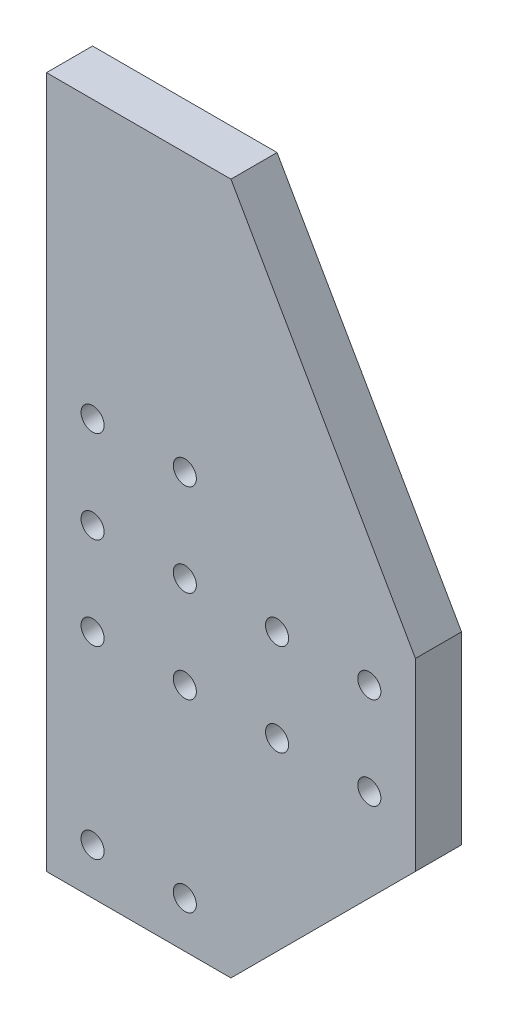
ISO-10303-21;
HEADER;
FILE_DESCRIPTION(('STEP AP214'),'2;1');
FILE_NAME('part.step','',(''),(''),'','','');
FILE_SCHEMA(('AUTOMOTIVE_DESIGN { 1 0 10303 214 1 1 1 1 }'));
ENDSEC;
DATA;
#1=APPLICATION_CONTEXT('core data for automotive mechanical design processes');
#2=APPLICATION_PROTOCOL_DEFINITION('international standard','automotive_design',2000,#1);
#3=PRODUCT_CONTEXT('',#1,'mechanical');
#4=PRODUCT('Part','Part','',(#3));
#5=PRODUCT_RELATED_PRODUCT_CATEGORY('part','',(#4));
#6=PRODUCT_DEFINITION_FORMATION('','',#4);
#7=PRODUCT_DEFINITION_CONTEXT('part definition',#1,'design');
#8=PRODUCT_DEFINITION('design','',#6,#7);
#9=PRODUCT_DEFINITION_SHAPE('','',#8);
#10=(LENGTH_UNIT() NAMED_UNIT(*) SI_UNIT(.MILLI.,.METRE.));
#11=(NAMED_UNIT(*) PLANE_ANGLE_UNIT() SI_UNIT($,.RADIAN.));
#12=(NAMED_UNIT(*) SI_UNIT($,.STERADIAN.) SOLID_ANGLE_UNIT());
#13=UNCERTAINTY_MEASURE_WITH_UNIT(LENGTH_MEASURE(1.E-05),#10,'distance_accuracy_value','');
#14=(GEOMETRIC_REPRESENTATION_CONTEXT(3) GLOBAL_UNCERTAINTY_ASSIGNED_CONTEXT((#13)) GLOBAL_UNIT_ASSIGNED_CONTEXT((#10,
#11,#12)) REPRESENTATION_CONTEXT('',''));
#15=CARTESIAN_POINT('',(0.,0.,0.));
#16=DIRECTION('',(0.,0.,1.));
#17=DIRECTION('',(1.,0.,0.));
#18=AXIS2_PLACEMENT_3D('',#15,#16,#17);
#19=CARTESIAN_POINT('',(0.,150.,10.));
#20=DIRECTION('',(1.,0.,0.));
#21=DIRECTION('',(0.,1.,0.));
#22=AXIS2_PLACEMENT_3D('',#19,#20,#21);
#23=PLANE('',#22);
#24=DIRECTION('',(0.,-1.,0.));
#25=VECTOR('',#24,1.);
#26=CARTESIAN_POINT('',(0.,150.,0.));
#27=LINE('',#26,#25);
#28=CARTESIAN_POINT('',(0.,150.,0.));
#29=VERTEX_POINT('',#28);
#30=CARTESIAN_POINT('',(0.,0.,0.));
#31=VERTEX_POINT('',#30);
#32=EDGE_CURVE('E132',#29,#31,#27,.T.);
#33=ORIENTED_EDGE('',*,*,#32,.T.);
#34=DIRECTION('',(0.,0.,-1.));
#35=VECTOR('',#34,1.);
#36=CARTESIAN_POINT('',(0.,0.,10.));
#37=LINE('',#36,#35);
#38=CARTESIAN_POINT('',(0.,0.,10.));
#39=VERTEX_POINT('',#38);
#40=EDGE_CURVE('E11',#39,#31,#37,.T.);
#41=ORIENTED_EDGE('',*,*,#40,.F.);
#42=DIRECTION('',(0.,-1.,0.));
#43=VECTOR('',#42,1.);
#44=CARTESIAN_POINT('',(0.,150.,10.));
#45=LINE('',#44,#43);
#46=CARTESIAN_POINT('',(0.,150.,10.));
#47=VERTEX_POINT('',#46);
#48=EDGE_CURVE('E149',#47,#39,#45,.T.);
#49=ORIENTED_EDGE('',*,*,#48,.F.);
#50=DIRECTION('',(0.,0.,-1.));
#51=VECTOR('',#50,1.);
#52=CARTESIAN_POINT('',(0.,150.,10.));
#53=LINE('',#52,#51);
#54=EDGE_CURVE('E128',#47,#29,#53,.T.);
#55=ORIENTED_EDGE('',*,*,#54,.T.);
#56=EDGE_LOOP('',(#33,#41,#49,#55));
#57=FACE_BOUND('',#56,.T.);
#58=ADVANCED_FACE('F43',(#57),#23,.F.);
#59=CARTESIAN_POINT('',(0.,0.,10.));
#60=DIRECTION('',(0.,1.,0.));
#61=DIRECTION('',(0.,0.,1.));
#62=AXIS2_PLACEMENT_3D('',#59,#60,#61);
#63=PLANE('',#62);
#64=DIRECTION('',(1.,0.,0.));
#65=VECTOR('',#64,1.);
#66=CARTESIAN_POINT('',(0.,0.,0.));
#67=LINE('',#66,#65);
#68=CARTESIAN_POINT('',(40.,0.,0.));
#69=VERTEX_POINT('',#68);
#70=EDGE_CURVE('E136',#31,#69,#67,.T.);
#71=ORIENTED_EDGE('',*,*,#70,.T.);
#72=DIRECTION('',(0.,0.,-1.));
#73=VECTOR('',#72,1.);
#74=CARTESIAN_POINT('',(40.,0.,10.));
#75=LINE('',#74,#73);
#76=CARTESIAN_POINT('',(40.,0.,10.));
#77=VERTEX_POINT('',#76);
#78=EDGE_CURVE('E52',#77,#69,#75,.T.);
#79=ORIENTED_EDGE('',*,*,#78,.F.);
#80=DIRECTION('',(1.,0.,0.));
#81=VECTOR('',#80,1.);
#82=CARTESIAN_POINT('',(0.,0.,10.));
#83=LINE('',#82,#81);
#84=EDGE_CURVE('E97',#39,#77,#83,.T.);
#85=ORIENTED_EDGE('',*,*,#84,.F.);
#86=ORIENTED_EDGE('',*,*,#40,.T.);
#87=EDGE_LOOP('',(#71,#79,#85,#86));
#88=FACE_BOUND('',#87,.T.);
#89=ADVANCED_FACE('F178',(#88),#63,.F.);
#90=CARTESIAN_POINT('',(40.,0.,10.));
#91=DIRECTION('',(-0.707106781186547,0.707106781186548,0.));
#92=DIRECTION('',(-0.707106781186548,-0.707106781186547,0.));
#93=AXIS2_PLACEMENT_3D('',#90,#91,#92);
#94=PLANE('',#93);
#95=DIRECTION('',(0.707106781186548,0.707106781186547,0.));
#96=VECTOR('',#95,1.);
#97=CARTESIAN_POINT('',(40.,0.,0.));
#98=LINE('',#97,#96);
#99=CARTESIAN_POINT('',(80.,40.,0.));
#100=VERTEX_POINT('',#99);
#101=EDGE_CURVE('E140',#69,#100,#98,.T.);
#102=ORIENTED_EDGE('',*,*,#101,.T.);
#103=DIRECTION('',(0.,0.,-1.));
#104=VECTOR('',#103,1.);
#105=CARTESIAN_POINT('',(80.,40.,10.));
#106=LINE('',#105,#104);
#107=CARTESIAN_POINT('',(80.,40.,10.));
#108=VERTEX_POINT('',#107);
#109=EDGE_CURVE('E121',#108,#100,#106,.T.);
#110=ORIENTED_EDGE('',*,*,#109,.F.);
#111=DIRECTION('',(0.707106781186548,0.707106781186547,0.));
#112=VECTOR('',#111,1.);
#113=CARTESIAN_POINT('',(40.,0.,10.));
#114=LINE('',#113,#112);
#115=EDGE_CURVE('E110',#77,#108,#114,.T.);
#116=ORIENTED_EDGE('',*,*,#115,.F.);
#117=ORIENTED_EDGE('',*,*,#78,.T.);
#118=EDGE_LOOP('',(#102,#110,#116,#117));
#119=FACE_BOUND('',#118,.T.);
#120=ADVANCED_FACE('F159',(#119),#94,.F.);
#121=CARTESIAN_POINT('',(80.,40.,10.));
#122=DIRECTION('',(-1.,0.,0.));
#123=DIRECTION('',(0.,0.,1.));
#124=AXIS2_PLACEMENT_3D('',#121,#122,#123);
#125=PLANE('',#124);
#126=DIRECTION('',(0.,1.,0.));
#127=VECTOR('',#126,1.);
#128=CARTESIAN_POINT('',(80.,40.,0.));
#129=LINE('',#128,#127);
#130=CARTESIAN_POINT('',(80.,80.,0.));
#131=VERTEX_POINT('',#130);
#132=EDGE_CURVE('E119',#100,#131,#129,.T.);
#133=ORIENTED_EDGE('',*,*,#132,.T.);
#134=DIRECTION('',(0.,0.,-1.));
#135=VECTOR('',#134,1.);
#136=CARTESIAN_POINT('',(80.,80.,10.));
#137=LINE('',#136,#135);
#138=CARTESIAN_POINT('',(80.,80.,10.));
#139=VERTEX_POINT('',#138);
#140=EDGE_CURVE('E116',#139,#131,#137,.T.);
#141=ORIENTED_EDGE('',*,*,#140,.F.);
#142=DIRECTION('',(0.,1.,0.));
#143=VECTOR('',#142,1.);
#144=CARTESIAN_POINT('',(80.,40.,10.));
#145=LINE('',#144,#143);
#146=EDGE_CURVE('E104',#108,#139,#145,.T.);
#147=ORIENTED_EDGE('',*,*,#146,.F.);
#148=ORIENTED_EDGE('',*,*,#109,.T.);
#149=EDGE_LOOP('',(#133,#141,#147,#148));
#150=FACE_BOUND('',#149,.T.);
#151=ADVANCED_FACE('F117',(#150),#125,.F.);
#152=CARTESIAN_POINT('',(80.,80.,10.));
#153=DIRECTION('',(-0.868243142124459,-0.496138938356834,0.));
#154=DIRECTION('',(0.496138938356834,-0.868243142124459,0.));
#155=AXIS2_PLACEMENT_3D('',#152,#153,#154);
#156=PLANE('',#155);
#157=DIRECTION('',(-0.496138938356834,0.868243142124459,0.));
#158=VECTOR('',#157,1.);
#159=CARTESIAN_POINT('',(80.,80.,0.));
#160=LINE('',#159,#158);
#161=CARTESIAN_POINT('',(40.,150.,0.));
#162=VERTEX_POINT('',#161);
#163=EDGE_CURVE('E83',#131,#162,#160,.T.);
#164=ORIENTED_EDGE('',*,*,#163,.T.);
#165=DIRECTION('',(0.,0.,-1.));
#166=VECTOR('',#165,1.);
#167=CARTESIAN_POINT('',(40.,150.,10.));
#168=LINE('',#167,#166);
#169=CARTESIAN_POINT('',(40.,150.,10.));
#170=VERTEX_POINT('',#169);
#171=EDGE_CURVE('E122',#170,#162,#168,.T.);
#172=ORIENTED_EDGE('',*,*,#171,.F.);
#173=DIRECTION('',(-0.496138938356834,0.868243142124459,0.));
#174=VECTOR('',#173,1.);
#175=CARTESIAN_POINT('',(80.,80.,10.));
#176=LINE('',#175,#174);
#177=EDGE_CURVE('E108',#139,#170,#176,.T.);
#178=ORIENTED_EDGE('',*,*,#177,.F.);
#179=ORIENTED_EDGE('',*,*,#140,.T.);
#180=EDGE_LOOP('',(#164,#172,#178,#179));
#181=FACE_BOUND('',#180,.T.);
#182=ADVANCED_FACE('F124',(#181),#156,.F.);
#183=CARTESIAN_POINT('',(40.,150.,10.));
#184=DIRECTION('',(0.,-1.,0.));
#185=DIRECTION('',(1.,0.,0.));
#186=AXIS2_PLACEMENT_3D('',#183,#184,#185);
#187=PLANE('',#186);
#188=DIRECTION('',(-1.,0.,0.));
#189=VECTOR('',#188,1.);
#190=CARTESIAN_POINT('',(40.,150.,0.));
#191=LINE('',#190,#189);
#192=EDGE_CURVE('E89',#162,#29,#191,.T.);
#193=ORIENTED_EDGE('',*,*,#192,.T.);
#194=ORIENTED_EDGE('',*,*,#54,.F.);
#195=DIRECTION('',(-1.,0.,0.));
#196=VECTOR('',#195,1.);
#197=CARTESIAN_POINT('',(40.,150.,10.));
#198=LINE('',#197,#196);
#199=EDGE_CURVE('E60',#170,#47,#198,.T.);
#200=ORIENTED_EDGE('',*,*,#199,.F.);
#201=ORIENTED_EDGE('',*,*,#171,.T.);
#202=EDGE_LOOP('',(#193,#194,#200,#201));
#203=FACE_BOUND('',#202,.T.);
#204=ADVANCED_FACE('F166',(#203),#187,.F.);
#205=CARTESIAN_POINT('',(0.,0.,10.));
#206=DIRECTION('',(0.,0.,1.));
#207=DIRECTION('',(1.,0.,0.));
#208=AXIS2_PLACEMENT_3D('',#205,#206,#207);
#209=PLANE('',#208);
#210=CARTESIAN_POINT('',(50.,50.,10.));
#211=DIRECTION('',(0.,0.,1.));
#212=DIRECTION('',(1.,0.,0.));
#213=AXIS2_PLACEMENT_3D('',#210,#211,#212);
#214=CIRCLE('',#213,2.5);
#215=CARTESIAN_POINT('',(52.5,50.,10.));
#216=VERTEX_POINT('',#215);
#217=EDGE_CURVE('E395',#216,#216,#214,.T.);
#218=ORIENTED_EDGE('',*,*,#217,.F.);
#219=EDGE_LOOP('',(#218));
#220=FACE_BOUND('',#219,.T.);
#221=CARTESIAN_POINT('',(30.,50.,10.));
#222=DIRECTION('',(0.,0.,1.));
#223=DIRECTION('',(1.,0.,0.));
#224=AXIS2_PLACEMENT_3D('',#221,#222,#223);
#225=CIRCLE('',#224,2.5);
#226=CARTESIAN_POINT('',(32.5,50.,10.));
#227=VERTEX_POINT('',#226);
#228=EDGE_CURVE('E400',#227,#227,#225,.T.);
#229=ORIENTED_EDGE('',*,*,#228,.F.);
#230=EDGE_LOOP('',(#229));
#231=FACE_BOUND('',#230,.T.);
#232=CARTESIAN_POINT('',(70.,50.,10.));
#233=DIRECTION('',(0.,0.,1.));
#234=DIRECTION('',(1.,0.,0.));
#235=AXIS2_PLACEMENT_3D('',#232,#233,#234);
#236=CIRCLE('',#235,2.50000000000001);
#237=CARTESIAN_POINT('',(72.5,50.,10.));
#238=VERTEX_POINT('',#237);
#239=EDGE_CURVE('E415',#238,#238,#236,.T.);
#240=ORIENTED_EDGE('',*,*,#239,.F.);
#241=EDGE_LOOP('',(#240));
#242=FACE_BOUND('',#241,.T.);
#243=CARTESIAN_POINT('',(30.,90.,10.));
#244=DIRECTION('',(0.,0.,1.));
#245=DIRECTION('',(1.,0.,0.));
#246=AXIS2_PLACEMENT_3D('',#243,#244,#245);
#247=CIRCLE('',#246,2.5);
#248=CARTESIAN_POINT('',(32.5,90.,10.));
#249=VERTEX_POINT('',#248);
#250=EDGE_CURVE('E410',#249,#249,#247,.T.);
#251=ORIENTED_EDGE('',*,*,#250,.F.);
#252=EDGE_LOOP('',(#251));
#253=FACE_BOUND('',#252,.T.);
#254=CARTESIAN_POINT('',(50.,70.,10.));
#255=DIRECTION('',(0.,0.,1.));
#256=DIRECTION('',(1.,0.,0.));
#257=AXIS2_PLACEMENT_3D('',#254,#255,#256);
#258=CIRCLE('',#257,2.5);
#259=CARTESIAN_POINT('',(52.5,70.,10.));
#260=VERTEX_POINT('',#259);
#261=EDGE_CURVE('E439',#260,#260,#258,.T.);
#262=ORIENTED_EDGE('',*,*,#261,.F.);
#263=EDGE_LOOP('',(#262));
#264=FACE_BOUND('',#263,.T.);
#265=CARTESIAN_POINT('',(70.,70.,10.));
#266=DIRECTION('',(0.,0.,1.));
#267=DIRECTION('',(1.,0.,0.));
#268=AXIS2_PLACEMENT_3D('',#265,#266,#267);
#269=CIRCLE('',#268,2.50000000000001);
#270=CARTESIAN_POINT('',(72.5,70.,10.));
#271=VERTEX_POINT('',#270);
#272=EDGE_CURVE('E431',#271,#271,#269,.T.);
#273=ORIENTED_EDGE('',*,*,#272,.F.);
#274=EDGE_LOOP('',(#273));
#275=FACE_BOUND('',#274,.T.);
#276=CARTESIAN_POINT('',(10.,50.,10.));
#277=DIRECTION('',(0.,0.,1.));
#278=DIRECTION('',(1.,0.,0.));
#279=AXIS2_PLACEMENT_3D('',#276,#277,#278);
#280=CIRCLE('',#279,2.5);
#281=CARTESIAN_POINT('',(12.5,50.,10.));
#282=VERTEX_POINT('',#281);
#283=EDGE_CURVE('E422',#282,#282,#280,.T.);
#284=ORIENTED_EDGE('',*,*,#283,.F.);
#285=EDGE_LOOP('',(#284));
#286=FACE_BOUND('',#285,.T.);
#287=CARTESIAN_POINT('',(30.,10.,10.));
#288=DIRECTION('',(0.,0.,1.));
#289=DIRECTION('',(1.,0.,0.));
#290=AXIS2_PLACEMENT_3D('',#287,#288,#289);
#291=CIRCLE('',#290,2.5);
#292=CARTESIAN_POINT('',(32.5,10.,10.));
#293=VERTEX_POINT('',#292);
#294=EDGE_CURVE('E421',#293,#293,#291,.T.);
#295=ORIENTED_EDGE('',*,*,#294,.F.);
#296=EDGE_LOOP('',(#295));
#297=FACE_BOUND('',#296,.T.);
#298=CARTESIAN_POINT('',(10.,90.,10.));
#299=DIRECTION('',(0.,0.,1.));
#300=DIRECTION('',(1.,0.,0.));
#301=AXIS2_PLACEMENT_3D('',#298,#299,#300);
#302=CIRCLE('',#301,2.5);
#303=CARTESIAN_POINT('',(12.5,90.,10.));
#304=VERTEX_POINT('',#303);
#305=EDGE_CURVE('E477',#304,#304,#302,.T.);
#306=ORIENTED_EDGE('',*,*,#305,.F.);
#307=EDGE_LOOP('',(#306));
#308=FACE_BOUND('',#307,.T.);
#309=CARTESIAN_POINT('',(10.,70.,10.));
#310=DIRECTION('',(0.,0.,1.));
#311=DIRECTION('',(1.,0.,0.));
#312=AXIS2_PLACEMENT_3D('',#309,#310,#311);
#313=CIRCLE('',#312,2.5);
#314=CARTESIAN_POINT('',(12.5,70.,10.));
#315=VERTEX_POINT('',#314);
#316=EDGE_CURVE('E481',#315,#315,#313,.T.);
#317=ORIENTED_EDGE('',*,*,#316,.F.);
#318=EDGE_LOOP('',(#317));
#319=FACE_BOUND('',#318,.T.);
#320=CARTESIAN_POINT('',(30.,70.,10.));
#321=DIRECTION('',(0.,0.,1.));
#322=DIRECTION('',(1.,0.,0.));
#323=AXIS2_PLACEMENT_3D('',#320,#321,#322);
#324=CIRCLE('',#323,2.5);
#325=CARTESIAN_POINT('',(32.5,70.,10.));
#326=VERTEX_POINT('',#325);
#327=EDGE_CURVE('E484',#326,#326,#324,.T.);
#328=ORIENTED_EDGE('',*,*,#327,.F.);
#329=EDGE_LOOP('',(#328));
#330=FACE_BOUND('',#329,.T.);
#331=CARTESIAN_POINT('',(10.,10.,10.));
#332=DIRECTION('',(0.,0.,1.));
#333=DIRECTION('',(1.,0.,0.));
#334=AXIS2_PLACEMENT_3D('',#331,#332,#333);
#335=CIRCLE('',#334,2.5);
#336=CARTESIAN_POINT('',(12.5,10.,10.));
#337=VERTEX_POINT('',#336);
#338=EDGE_CURVE('E426',#337,#337,#335,.T.);
#339=ORIENTED_EDGE('',*,*,#338,.F.);
#340=EDGE_LOOP('',(#339));
#341=FACE_BOUND('',#340,.T.);
#342=ORIENTED_EDGE('',*,*,#48,.T.);
#343=ORIENTED_EDGE('',*,*,#84,.T.);
#344=ORIENTED_EDGE('',*,*,#115,.T.);
#345=ORIENTED_EDGE('',*,*,#146,.T.);
#346=ORIENTED_EDGE('',*,*,#177,.T.);
#347=ORIENTED_EDGE('',*,*,#199,.T.);
#348=EDGE_LOOP('',(#342,#343,#344,#345,#346,#347));
#349=FACE_BOUND('',#348,.T.);
#350=ADVANCED_FACE('F106',(#220,#231,#242,#253,#264,#275,#286,#297,#308,#319,#330,#341,#349),
#209,.T.);
#351=CARTESIAN_POINT('',(0.,0.,0.));
#352=DIRECTION('',(0.,0.,1.));
#353=DIRECTION('',(1.,0.,0.));
#354=AXIS2_PLACEMENT_3D('',#351,#352,#353);
#355=PLANE('',#354);
#356=CARTESIAN_POINT('',(50.,50.,0.));
#357=DIRECTION('',(0.,0.,1.));
#358=DIRECTION('',(1.,0.,0.));
#359=AXIS2_PLACEMENT_3D('',#356,#357,#358);
#360=CIRCLE('',#359,2.5);
#361=CARTESIAN_POINT('',(52.5,50.,0.));
#362=VERTEX_POINT('',#361);
#363=EDGE_CURVE('E398',#362,#362,#360,.F.);
#364=ORIENTED_EDGE('',*,*,#363,.F.);
#365=EDGE_LOOP('',(#364));
#366=FACE_BOUND('',#365,.T.);
#367=CARTESIAN_POINT('',(30.,50.,0.));
#368=DIRECTION('',(0.,0.,1.));
#369=DIRECTION('',(1.,0.,0.));
#370=AXIS2_PLACEMENT_3D('',#367,#368,#369);
#371=CIRCLE('',#370,2.5);
#372=CARTESIAN_POINT('',(32.5,50.,0.));
#373=VERTEX_POINT('',#372);
#374=EDGE_CURVE('E407',#373,#373,#371,.F.);
#375=ORIENTED_EDGE('',*,*,#374,.F.);
#376=EDGE_LOOP('',(#375));
#377=FACE_BOUND('',#376,.T.);
#378=CARTESIAN_POINT('',(70.,50.,0.));
#379=DIRECTION('',(0.,0.,1.));
#380=DIRECTION('',(1.,0.,0.));
#381=AXIS2_PLACEMENT_3D('',#378,#379,#380);
#382=CIRCLE('',#381,2.50000000000001);
#383=CARTESIAN_POINT('',(72.5,50.,0.));
#384=VERTEX_POINT('',#383);
#385=EDGE_CURVE('E497',#384,#384,#382,.F.);
#386=ORIENTED_EDGE('',*,*,#385,.F.);
#387=EDGE_LOOP('',(#386));
#388=FACE_BOUND('',#387,.T.);
#389=CARTESIAN_POINT('',(30.,90.,0.));
#390=DIRECTION('',(0.,0.,1.));
#391=DIRECTION('',(1.,0.,0.));
#392=AXIS2_PLACEMENT_3D('',#389,#390,#391);
#393=CIRCLE('',#392,2.5);
#394=CARTESIAN_POINT('',(32.5,90.,0.));
#395=VERTEX_POINT('',#394);
#396=EDGE_CURVE('E503',#395,#395,#393,.F.);
#397=ORIENTED_EDGE('',*,*,#396,.F.);
#398=EDGE_LOOP('',(#397));
#399=FACE_BOUND('',#398,.T.);
#400=CARTESIAN_POINT('',(50.,70.,0.));
#401=DIRECTION('',(0.,0.,1.));
#402=DIRECTION('',(1.,0.,0.));
#403=AXIS2_PLACEMENT_3D('',#400,#401,#402);
#404=CIRCLE('',#403,2.5);
#405=CARTESIAN_POINT('',(52.5,70.,0.));
#406=VERTEX_POINT('',#405);
#407=EDGE_CURVE('E404',#406,#406,#404,.F.);
#408=ORIENTED_EDGE('',*,*,#407,.F.);
#409=EDGE_LOOP('',(#408));
#410=FACE_BOUND('',#409,.T.);
#411=CARTESIAN_POINT('',(70.,70.,0.));
#412=DIRECTION('',(0.,0.,1.));
#413=DIRECTION('',(1.,0.,0.));
#414=AXIS2_PLACEMENT_3D('',#411,#412,#413);
#415=CIRCLE('',#414,2.50000000000001);
#416=CARTESIAN_POINT('',(72.5,70.,0.));
#417=VERTEX_POINT('',#416);
#418=EDGE_CURVE('E435',#417,#417,#415,.F.);
#419=ORIENTED_EDGE('',*,*,#418,.F.);
#420=EDGE_LOOP('',(#419));
#421=FACE_BOUND('',#420,.T.);
#422=CARTESIAN_POINT('',(10.,50.,0.));
#423=DIRECTION('',(0.,0.,1.));
#424=DIRECTION('',(1.,0.,0.));
#425=AXIS2_PLACEMENT_3D('',#422,#423,#424);
#426=CIRCLE('',#425,2.5);
#427=CARTESIAN_POINT('',(12.5,50.,0.));
#428=VERTEX_POINT('',#427);
#429=EDGE_CURVE('E427',#428,#428,#426,.F.);
#430=ORIENTED_EDGE('',*,*,#429,.F.);
#431=EDGE_LOOP('',(#430));
#432=FACE_BOUND('',#431,.T.);
#433=CARTESIAN_POINT('',(30.,10.,0.));
#434=DIRECTION('',(0.,0.,1.));
#435=DIRECTION('',(1.,0.,0.));
#436=AXIS2_PLACEMENT_3D('',#433,#434,#435);
#437=CIRCLE('',#436,2.5);
#438=CARTESIAN_POINT('',(32.5,10.,0.));
#439=VERTEX_POINT('',#438);
#440=EDGE_CURVE('E417',#439,#439,#437,.F.);
#441=ORIENTED_EDGE('',*,*,#440,.F.);
#442=EDGE_LOOP('',(#441));
#443=FACE_BOUND('',#442,.T.);
#444=CARTESIAN_POINT('',(10.,90.,0.));
#445=DIRECTION('',(0.,0.,1.));
#446=DIRECTION('',(1.,0.,0.));
#447=AXIS2_PLACEMENT_3D('',#444,#445,#446);
#448=CIRCLE('',#447,2.5);
#449=CARTESIAN_POINT('',(12.5,90.,0.));
#450=VERTEX_POINT('',#449);
#451=EDGE_CURVE('E511',#450,#450,#448,.F.);
#452=ORIENTED_EDGE('',*,*,#451,.F.);
#453=EDGE_LOOP('',(#452));
#454=FACE_BOUND('',#453,.T.);
#455=CARTESIAN_POINT('',(10.,70.,0.));
#456=DIRECTION('',(0.,0.,1.));
#457=DIRECTION('',(1.,0.,0.));
#458=AXIS2_PLACEMENT_3D('',#455,#456,#457);
#459=CIRCLE('',#458,2.5);
#460=CARTESIAN_POINT('',(12.5,70.,0.));
#461=VERTEX_POINT('',#460);
#462=EDGE_CURVE('E486',#461,#461,#459,.F.);
#463=ORIENTED_EDGE('',*,*,#462,.F.);
#464=EDGE_LOOP('',(#463));
#465=FACE_BOUND('',#464,.T.);
#466=CARTESIAN_POINT('',(30.,70.,0.));
#467=DIRECTION('',(0.,0.,1.));
#468=DIRECTION('',(1.,0.,0.));
#469=AXIS2_PLACEMENT_3D('',#466,#467,#468);
#470=CIRCLE('',#469,2.5);
#471=CARTESIAN_POINT('',(32.5,70.,0.));
#472=VERTEX_POINT('',#471);
#473=EDGE_CURVE('E487',#472,#472,#470,.F.);
#474=ORIENTED_EDGE('',*,*,#473,.F.);
#475=EDGE_LOOP('',(#474));
#476=FACE_BOUND('',#475,.T.);
#477=CARTESIAN_POINT('',(10.,10.,0.));
#478=DIRECTION('',(0.,0.,1.));
#479=DIRECTION('',(1.,0.,0.));
#480=AXIS2_PLACEMENT_3D('',#477,#478,#479);
#481=CIRCLE('',#480,2.5);
#482=CARTESIAN_POINT('',(12.5,10.,0.));
#483=VERTEX_POINT('',#482);
#484=EDGE_CURVE('E137',#483,#483,#481,.F.);
#485=ORIENTED_EDGE('',*,*,#484,.F.);
#486=EDGE_LOOP('',(#485));
#487=FACE_BOUND('',#486,.T.);
#488=ORIENTED_EDGE('',*,*,#32,.F.);
#489=ORIENTED_EDGE('',*,*,#192,.F.);
#490=ORIENTED_EDGE('',*,*,#163,.F.);
#491=ORIENTED_EDGE('',*,*,#132,.F.);
#492=ORIENTED_EDGE('',*,*,#101,.F.);
#493=ORIENTED_EDGE('',*,*,#70,.F.);
#494=EDGE_LOOP('',(#488,#489,#490,#491,#492,#493));
#495=FACE_BOUND('',#494,.T.);
#496=ADVANCED_FACE('F162',(#366,#377,#388,#399,#410,#421,#432,#443,#454,#465,#476,#487,#495),
#355,.F.);
#497=CARTESIAN_POINT('',(10.,10.,-0.000999999999999265));
#498=DIRECTION('',(0.,0.,1.));
#499=DIRECTION('',(1.,0.,0.));
#500=AXIS2_PLACEMENT_3D('',#497,#498,#499);
#501=CYLINDRICAL_SURFACE('',#500,2.5);
#502=ORIENTED_EDGE('',*,*,#338,.T.);
#503=EDGE_LOOP('',(#502));
#504=FACE_BOUND('',#503,.T.);
#505=ORIENTED_EDGE('',*,*,#484,.T.);
#506=EDGE_LOOP('',(#505));
#507=FACE_BOUND('',#506,.T.);
#508=ADVANCED_FACE('F218',(#504,#507),#501,.F.);
#509=CARTESIAN_POINT('',(30.,70.,-0.000999999999999265));
#510=DIRECTION('',(0.,0.,1.));
#511=DIRECTION('',(1.,0.,0.));
#512=AXIS2_PLACEMENT_3D('',#509,#510,#511);
#513=CYLINDRICAL_SURFACE('',#512,2.5);
#514=ORIENTED_EDGE('',*,*,#327,.T.);
#515=EDGE_LOOP('',(#514));
#516=FACE_BOUND('',#515,.T.);
#517=ORIENTED_EDGE('',*,*,#473,.T.);
#518=EDGE_LOOP('',(#517));
#519=FACE_BOUND('',#518,.T.);
#520=ADVANCED_FACE('F228',(#516,#519),#513,.F.);
#521=CARTESIAN_POINT('',(10.,70.,-0.000999999999999265));
#522=DIRECTION('',(0.,0.,1.));
#523=DIRECTION('',(1.,0.,0.));
#524=AXIS2_PLACEMENT_3D('',#521,#522,#523);
#525=CYLINDRICAL_SURFACE('',#524,2.5);
#526=ORIENTED_EDGE('',*,*,#316,.T.);
#527=EDGE_LOOP('',(#526));
#528=FACE_BOUND('',#527,.T.);
#529=ORIENTED_EDGE('',*,*,#462,.T.);
#530=EDGE_LOOP('',(#529));
#531=FACE_BOUND('',#530,.T.);
#532=ADVANCED_FACE('F239',(#528,#531),#525,.F.);
#533=CARTESIAN_POINT('',(10.,90.,-0.000999999999999265));
#534=DIRECTION('',(0.,0.,1.));
#535=DIRECTION('',(1.,0.,0.));
#536=AXIS2_PLACEMENT_3D('',#533,#534,#535);
#537=CYLINDRICAL_SURFACE('',#536,2.5);
#538=ORIENTED_EDGE('',*,*,#305,.T.);
#539=EDGE_LOOP('',(#538));
#540=FACE_BOUND('',#539,.T.);
#541=ORIENTED_EDGE('',*,*,#451,.T.);
#542=EDGE_LOOP('',(#541));
#543=FACE_BOUND('',#542,.T.);
#544=ADVANCED_FACE('F250',(#540,#543),#537,.F.);
#545=CARTESIAN_POINT('',(30.,10.,-0.000999999999999265));
#546=DIRECTION('',(0.,0.,1.));
#547=DIRECTION('',(1.,0.,0.));
#548=AXIS2_PLACEMENT_3D('',#545,#546,#547);
#549=CYLINDRICAL_SURFACE('',#548,2.5);
#550=ORIENTED_EDGE('',*,*,#294,.T.);
#551=EDGE_LOOP('',(#550));
#552=FACE_BOUND('',#551,.T.);
#553=ORIENTED_EDGE('',*,*,#440,.T.);
#554=EDGE_LOOP('',(#553));
#555=FACE_BOUND('',#554,.T.);
#556=ADVANCED_FACE('F261',(#552,#555),#549,.F.);
#557=CARTESIAN_POINT('',(10.,50.,-0.000999999999999265));
#558=DIRECTION('',(0.,0.,1.));
#559=DIRECTION('',(1.,0.,0.));
#560=AXIS2_PLACEMENT_3D('',#557,#558,#559);
#561=CYLINDRICAL_SURFACE('',#560,2.5);
#562=ORIENTED_EDGE('',*,*,#283,.T.);
#563=EDGE_LOOP('',(#562));
#564=FACE_BOUND('',#563,.T.);
#565=ORIENTED_EDGE('',*,*,#429,.T.);
#566=EDGE_LOOP('',(#565));
#567=FACE_BOUND('',#566,.T.);
#568=ADVANCED_FACE('F272',(#564,#567),#561,.F.);
#569=CARTESIAN_POINT('',(70.,70.,-0.000999999999999265));
#570=DIRECTION('',(0.,0.,1.));
#571=DIRECTION('',(1.,0.,0.));
#572=AXIS2_PLACEMENT_3D('',#569,#570,#571);
#573=CYLINDRICAL_SURFACE('',#572,2.50000000000001);
#574=ORIENTED_EDGE('',*,*,#272,.T.);
#575=EDGE_LOOP('',(#574));
#576=FACE_BOUND('',#575,.T.);
#577=ORIENTED_EDGE('',*,*,#418,.T.);
#578=EDGE_LOOP('',(#577));
#579=FACE_BOUND('',#578,.T.);
#580=ADVANCED_FACE('F283',(#576,#579),#573,.F.);
#581=CARTESIAN_POINT('',(50.,70.,-0.000999999999999265));
#582=DIRECTION('',(0.,0.,1.));
#583=DIRECTION('',(1.,0.,0.));
#584=AXIS2_PLACEMENT_3D('',#581,#582,#583);
#585=CYLINDRICAL_SURFACE('',#584,2.5);
#586=ORIENTED_EDGE('',*,*,#261,.T.);
#587=EDGE_LOOP('',(#586));
#588=FACE_BOUND('',#587,.T.);
#589=ORIENTED_EDGE('',*,*,#407,.T.);
#590=EDGE_LOOP('',(#589));
#591=FACE_BOUND('',#590,.T.);
#592=ADVANCED_FACE('F294',(#588,#591),#585,.F.);
#593=CARTESIAN_POINT('',(30.,90.,-0.000999999999999265));
#594=DIRECTION('',(0.,0.,1.));
#595=DIRECTION('',(1.,0.,0.));
#596=AXIS2_PLACEMENT_3D('',#593,#594,#595);
#597=CYLINDRICAL_SURFACE('',#596,2.5);
#598=ORIENTED_EDGE('',*,*,#250,.T.);
#599=EDGE_LOOP('',(#598));
#600=FACE_BOUND('',#599,.T.);
#601=ORIENTED_EDGE('',*,*,#396,.T.);
#602=EDGE_LOOP('',(#601));
#603=FACE_BOUND('',#602,.T.);
#604=ADVANCED_FACE('F305',(#600,#603),#597,.F.);
#605=CARTESIAN_POINT('',(70.,50.,-0.000999999999999265));
#606=DIRECTION('',(0.,0.,1.));
#607=DIRECTION('',(1.,0.,0.));
#608=AXIS2_PLACEMENT_3D('',#605,#606,#607);
#609=CYLINDRICAL_SURFACE('',#608,2.50000000000001);
#610=ORIENTED_EDGE('',*,*,#239,.T.);
#611=EDGE_LOOP('',(#610));
#612=FACE_BOUND('',#611,.T.);
#613=ORIENTED_EDGE('',*,*,#385,.T.);
#614=EDGE_LOOP('',(#613));
#615=FACE_BOUND('',#614,.T.);
#616=ADVANCED_FACE('F316',(#612,#615),#609,.F.);
#617=CARTESIAN_POINT('',(30.,50.,-0.000999999999999265));
#618=DIRECTION('',(0.,0.,1.));
#619=DIRECTION('',(1.,0.,0.));
#620=AXIS2_PLACEMENT_3D('',#617,#618,#619);
#621=CYLINDRICAL_SURFACE('',#620,2.5);
#622=ORIENTED_EDGE('',*,*,#228,.T.);
#623=EDGE_LOOP('',(#622));
#624=FACE_BOUND('',#623,.T.);
#625=ORIENTED_EDGE('',*,*,#374,.T.);
#626=EDGE_LOOP('',(#625));
#627=FACE_BOUND('',#626,.T.);
#628=ADVANCED_FACE('F327',(#624,#627),#621,.F.);
#629=CARTESIAN_POINT('',(50.,50.,-0.000999999999999265));
#630=DIRECTION('',(0.,0.,1.));
#631=DIRECTION('',(1.,0.,0.));
#632=AXIS2_PLACEMENT_3D('',#629,#630,#631);
#633=CYLINDRICAL_SURFACE('',#632,2.5);
#634=ORIENTED_EDGE('',*,*,#217,.T.);
#635=EDGE_LOOP('',(#634));
#636=FACE_BOUND('',#635,.T.);
#637=ORIENTED_EDGE('',*,*,#363,.T.);
#638=EDGE_LOOP('',(#637));
#639=FACE_BOUND('',#638,.T.);
#640=ADVANCED_FACE('F338',(#636,#639),#633,.F.);
#641=CLOSED_SHELL('',(#58,#89,#120,#151,#182,#204,#350,#496,#508,#520,#532,#544,#556,#568,#580,
#592,#604,#616,#628,#640));
#642=MANIFOLD_SOLID_BREP('B2',#641);
#643=ADVANCED_BREP_SHAPE_REPRESENTATION('',(#18,#642),#14);
#644=SHAPE_DEFINITION_REPRESENTATION(#9,#643);
ENDSEC;
END-ISO-10303-21;
